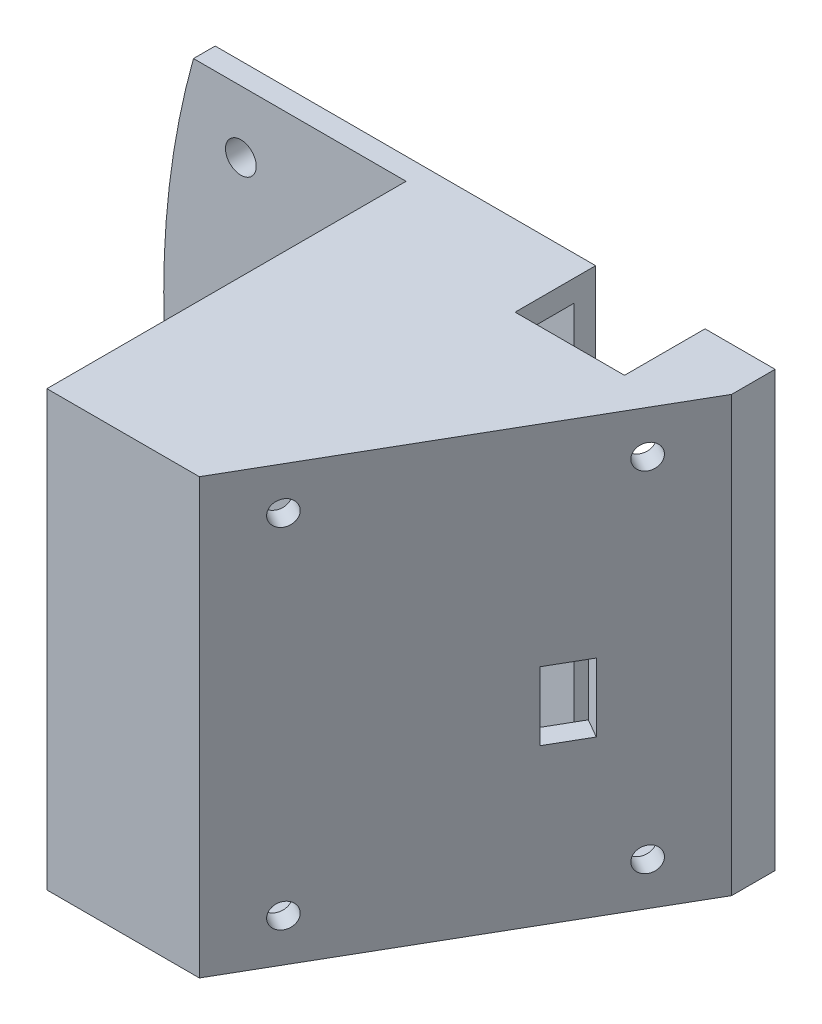
ISO-10303-21;
HEADER;
FILE_DESCRIPTION(('STEP AP214'),'2;1');
FILE_NAME('part.step','',(''),(''),'','','');
FILE_SCHEMA(('AUTOMOTIVE_DESIGN { 1 0 10303 214 1 1 1 1 }'));
ENDSEC;
DATA;
#1=APPLICATION_CONTEXT('core data for automotive mechanical design processes');
#2=APPLICATION_PROTOCOL_DEFINITION('international standard','automotive_design',2000,#1);
#3=PRODUCT_CONTEXT('',#1,'mechanical');
#4=PRODUCT('Part','Part','',(#3));
#5=PRODUCT_RELATED_PRODUCT_CATEGORY('part','',(#4));
#6=PRODUCT_DEFINITION_FORMATION('','',#4);
#7=PRODUCT_DEFINITION_CONTEXT('part definition',#1,'design');
#8=PRODUCT_DEFINITION('design','',#6,#7);
#9=PRODUCT_DEFINITION_SHAPE('','',#8);
#10=(LENGTH_UNIT() NAMED_UNIT(*) SI_UNIT(.MILLI.,.METRE.));
#11=(NAMED_UNIT(*) PLANE_ANGLE_UNIT() SI_UNIT($,.RADIAN.));
#12=(NAMED_UNIT(*) SI_UNIT($,.STERADIAN.) SOLID_ANGLE_UNIT());
#13=UNCERTAINTY_MEASURE_WITH_UNIT(LENGTH_MEASURE(1.E-05),#10,'distance_accuracy_value','');
#14=(GEOMETRIC_REPRESENTATION_CONTEXT(3) GLOBAL_UNCERTAINTY_ASSIGNED_CONTEXT((#13)) GLOBAL_UNIT_ASSIGNED_CONTEXT((#10,
#11,#12)) REPRESENTATION_CONTEXT('',''));
#15=CARTESIAN_POINT('',(0.,0.,0.));
#16=DIRECTION('',(0.,0.,1.));
#17=DIRECTION('',(1.,0.,0.));
#18=AXIS2_PLACEMENT_3D('',#15,#16,#17);
#19=CARTESIAN_POINT('',(-31.75,31.75,6.35));
#20=DIRECTION('',(-0.86602540378444,0.,-0.499999999999998));
#21=DIRECTION('',(-0.499999999999998,0.,0.86602540378444));
#22=AXIS2_PLACEMENT_3D('',#19,#20,#21);
#23=PLANE('',#22);
#24=CARTESIAN_POINT('',(-55.7499999999999,-25.5,47.9192193816531));
#25=DIRECTION('',(0.86602540378444,0.,0.499999999999998));
#26=DIRECTION('',(0.499999999999998,0.,-0.86602540378444));
#27=AXIS2_PLACEMENT_3D('',#24,#25,#26);
#28=CIRCLE('',#27,1.8);
#29=CARTESIAN_POINT('',(-54.8499999999999,-25.5,46.3603736548411));
#30=VERTEX_POINT('',#29);
#31=EDGE_CURVE('E266',#30,#30,#28,.T.);
#32=ORIENTED_EDGE('',*,*,#31,.F.);
#33=EDGE_LOOP('',(#32));
#34=FACE_BOUND('',#33,.T.);
#35=CARTESIAN_POINT('',(-36.25,-25.5,14.14422863406));
#36=DIRECTION('',(0.86602540378444,0.,0.499999999999998));
#37=DIRECTION('',(0.499999999999998,0.,-0.86602540378444));
#38=AXIS2_PLACEMENT_3D('',#35,#36,#37);
#39=CIRCLE('',#38,1.8);
#40=CARTESIAN_POINT('',(-35.35,-25.5,12.585382907248));
#41=VERTEX_POINT('',#40);
#42=EDGE_CURVE('E284',#41,#41,#39,.T.);
#43=ORIENTED_EDGE('',*,*,#42,.F.);
#44=EDGE_LOOP('',(#43));
#45=FACE_BOUND('',#44,.T.);
#46=DIRECTION('',(0.,-1.,0.));
#47=VECTOR('',#46,1.);
#48=CARTESIAN_POINT('',(-60.2499999999999,31.75,55.7134480157131));
#49=LINE('',#48,#47);
#50=CARTESIAN_POINT('',(-60.2499999999999,31.75,55.7134480157131));
#51=VERTEX_POINT('',#50);
#52=CARTESIAN_POINT('',(-60.2499999999999,-31.75,55.7134480157131));
#53=VERTEX_POINT('',#52);
#54=EDGE_CURVE('E398',#51,#53,#49,.T.);
#55=ORIENTED_EDGE('',*,*,#54,.T.);
#56=DIRECTION('',(0.499999999999998,0.,-0.86602540378444));
#57=VECTOR('',#56,1.);
#58=CARTESIAN_POINT('',(-31.75,-31.75,6.35));
#59=LINE('',#58,#57);
#60=CARTESIAN_POINT('',(-31.75,-31.75,6.35));
#61=VERTEX_POINT('',#60);
#62=EDGE_CURVE('E376',#53,#61,#59,.T.);
#63=ORIENTED_EDGE('',*,*,#62,.T.);
#64=DIRECTION('',(0.,-1.,0.));
#65=VECTOR('',#64,1.);
#66=CARTESIAN_POINT('',(-31.75,31.75,6.35));
#67=LINE('',#66,#65);
#68=CARTESIAN_POINT('',(-31.75,31.75,6.35));
#69=VERTEX_POINT('',#68);
#70=EDGE_CURVE('E396',#69,#61,#67,.T.);
#71=ORIENTED_EDGE('',*,*,#70,.F.);
#72=DIRECTION('',(0.499999999999998,0.,-0.86602540378444));
#73=VECTOR('',#72,1.);
#74=CARTESIAN_POINT('',(-31.75,31.75,6.35));
#75=LINE('',#74,#73);
#76=EDGE_CURVE('E389',#51,#69,#75,.T.);
#77=ORIENTED_EDGE('',*,*,#76,.F.);
#78=EDGE_LOOP('',(#55,#63,#71,#77));
#79=FACE_BOUND('',#78,.T.);
#80=CARTESIAN_POINT('',(-36.25,25.5,14.14422863406));
#81=DIRECTION('',(0.86602540378444,0.,0.499999999999998));
#82=DIRECTION('',(0.499999999999998,0.,-0.86602540378444));
#83=AXIS2_PLACEMENT_3D('',#80,#81,#82);
#84=CIRCLE('',#83,1.8);
#85=CARTESIAN_POINT('',(-35.35,25.5,12.585382907248));
#86=VERTEX_POINT('',#85);
#87=EDGE_CURVE('E278',#86,#86,#84,.T.);
#88=ORIENTED_EDGE('',*,*,#87,.F.);
#89=EDGE_LOOP('',(#88));
#90=FACE_BOUND('',#89,.T.);
#91=CARTESIAN_POINT('',(-55.7499999999999,25.5,47.9192193816531));
#92=DIRECTION('',(0.86602540378444,0.,0.499999999999998));
#93=DIRECTION('',(0.499999999999998,0.,-0.86602540378444));
#94=AXIS2_PLACEMENT_3D('',#91,#92,#93);
#95=CIRCLE('',#94,1.8);
#96=CARTESIAN_POINT('',(-54.8499999999999,25.5,46.3603736548411));
#97=VERTEX_POINT('',#96);
#98=EDGE_CURVE('E272',#97,#97,#95,.T.);
#99=ORIENTED_EDGE('',*,*,#98,.F.);
#100=EDGE_LOOP('',(#99));
#101=FACE_BOUND('',#100,.T.);
#102=DIRECTION('',(0.,1.,0.));
#103=VECTOR('',#102,1.);
#104=CARTESIAN_POINT('',(-42.,1.00000000000002,24.103520777581));
#105=LINE('',#104,#103);
#106=CARTESIAN_POINT('',(-42.,-8.99999999999998,24.103520777581));
#107=VERTEX_POINT('',#106);
#108=CARTESIAN_POINT('',(-42.,1.00000000000002,24.103520777581));
#109=VERTEX_POINT('',#108);
#110=EDGE_CURVE('E50',#107,#109,#105,.T.);
#111=ORIENTED_EDGE('',*,*,#110,.T.);
#112=DIRECTION('',(0.499999999999998,0.,-0.86602540378444));
#113=VECTOR('',#112,1.);
#114=CARTESIAN_POINT('',(-39.,1.00000000000002,18.9073683548744));
#115=LINE('',#114,#113);
#116=CARTESIAN_POINT('',(-39.,1.00000000000002,18.9073683548744));
#117=VERTEX_POINT('',#116);
#118=EDGE_CURVE('E201',#109,#117,#115,.T.);
#119=ORIENTED_EDGE('',*,*,#118,.T.);
#120=DIRECTION('',(0.,-1.,0.));
#121=VECTOR('',#120,1.);
#122=CARTESIAN_POINT('',(-39.,1.00000000000002,18.9073683548744));
#123=LINE('',#122,#121);
#124=CARTESIAN_POINT('',(-39.,-8.99999999999998,18.9073683548744));
#125=VERTEX_POINT('',#124);
#126=EDGE_CURVE('E222',#117,#125,#123,.T.);
#127=ORIENTED_EDGE('',*,*,#126,.T.);
#128=DIRECTION('',(-0.499999999999998,0.,0.86602540378444));
#129=VECTOR('',#128,1.);
#130=CARTESIAN_POINT('',(-39.,-8.99999999999998,18.9073683548744));
#131=LINE('',#130,#129);
#132=EDGE_CURVE('E218',#125,#107,#131,.T.);
#133=ORIENTED_EDGE('',*,*,#132,.T.);
#134=EDGE_LOOP('',(#111,#119,#127,#133));
#135=FACE_BOUND('',#134,.T.);
#136=ADVANCED_FACE('F35',(#34,#45,#79,#90,#101,#135),#23,.F.);
#137=CARTESIAN_POINT('',(-34.4996306570156,31.75,4.76250000000001));
#138=DIRECTION('',(-0.86602540378444,0.,-0.499999999999998));
#139=DIRECTION('',(-0.499999999999998,0.,0.86602540378444));
#140=AXIS2_PLACEMENT_3D('',#137,#138,#139);
#141=PLANE('',#140);
#142=CARTESIAN_POINT('',(-38.9996306570156,25.5,12.55672863406));
#143=DIRECTION('',(-0.86602540378444,0.,-0.499999999999998));
#144=DIRECTION('',(-0.499999999999998,0.,0.86602540378444));
#145=AXIS2_PLACEMENT_3D('',#142,#143,#144);
#146=CIRCLE('',#145,1.8);
#147=CARTESIAN_POINT('',(-39.8996306570156,25.5,14.115574360872));
#148=VERTEX_POINT('',#147);
#149=EDGE_CURVE('E281',#148,#148,#146,.F.);
#150=ORIENTED_EDGE('',*,*,#149,.T.);
#151=EDGE_LOOP('',(#150));
#152=FACE_BOUND('',#151,.T.);
#153=DIRECTION('',(0.,-1.,0.));
#154=VECTOR('',#153,1.);
#155=CARTESIAN_POINT('',(-62.0830871046769,31.75,52.5384480157131));
#156=LINE('',#155,#154);
#157=CARTESIAN_POINT('',(-62.0830871046769,28.575,52.5384480157131));
#158=VERTEX_POINT('',#157);
#159=CARTESIAN_POINT('',(-62.0830871046769,-28.575,52.5384480157131));
#160=VERTEX_POINT('',#159);
#161=EDGE_CURVE('E312',#158,#160,#156,.T.);
#162=ORIENTED_EDGE('',*,*,#161,.F.);
#163=DIRECTION('',(0.499999999999998,0.,-0.86602540378444));
#164=VECTOR('',#163,1.);
#165=CARTESIAN_POINT('',(-23.8125000000001,28.575,-13.7481532850779));
#166=LINE('',#165,#164);
#167=CARTESIAN_POINT('',(-34.925,28.575,5.49926131403118));
#168=VERTEX_POINT('',#167);
#169=EDGE_CURVE('E310',#158,#168,#166,.T.);
#170=ORIENTED_EDGE('',*,*,#169,.T.);
#171=DIRECTION('',(0.,-1.,0.));
#172=VECTOR('',#171,1.);
#173=CARTESIAN_POINT('',(-34.925,31.75,5.49926131403118));
#174=LINE('',#173,#172);
#175=CARTESIAN_POINT('',(-34.925,-28.575,5.49926131403118));
#176=VERTEX_POINT('',#175);
#177=EDGE_CURVE('E294',#168,#176,#174,.T.);
#178=ORIENTED_EDGE('',*,*,#177,.T.);
#179=DIRECTION('',(0.499999999999998,0.,-0.86602540378444));
#180=VECTOR('',#179,1.);
#181=CARTESIAN_POINT('',(-23.8125000000001,-28.575,-13.7481532850779));
#182=LINE('',#181,#180);
#183=EDGE_CURVE('E308',#160,#176,#182,.T.);
#184=ORIENTED_EDGE('',*,*,#183,.F.);
#185=EDGE_LOOP('',(#162,#170,#178,#184));
#186=FACE_BOUND('',#185,.T.);
#187=CARTESIAN_POINT('',(-38.9996306570156,-25.5,12.55672863406));
#188=DIRECTION('',(-0.86602540378444,0.,-0.499999999999998));
#189=DIRECTION('',(-0.499999999999998,0.,0.86602540378444));
#190=AXIS2_PLACEMENT_3D('',#187,#188,#189);
#191=CIRCLE('',#190,1.8);
#192=CARTESIAN_POINT('',(-39.8996306570156,-25.5,14.115574360872));
#193=VERTEX_POINT('',#192);
#194=EDGE_CURVE('E287',#193,#193,#191,.F.);
#195=ORIENTED_EDGE('',*,*,#194,.T.);
#196=EDGE_LOOP('',(#195));
#197=FACE_BOUND('',#196,.T.);
#198=CARTESIAN_POINT('',(-58.4996306570155,25.5,46.3317193816531));
#199=DIRECTION('',(-0.86602540378444,0.,-0.499999999999998));
#200=DIRECTION('',(-0.499999999999998,0.,0.86602540378444));
#201=AXIS2_PLACEMENT_3D('',#198,#199,#200);
#202=CIRCLE('',#201,1.8);
#203=CARTESIAN_POINT('',(-59.3996306570155,25.5,47.8905651084651));
#204=VERTEX_POINT('',#203);
#205=EDGE_CURVE('E275',#204,#204,#202,.F.);
#206=ORIENTED_EDGE('',*,*,#205,.T.);
#207=EDGE_LOOP('',(#206));
#208=FACE_BOUND('',#207,.T.);
#209=CARTESIAN_POINT('',(-58.4996306570155,-25.5,46.3317193816531));
#210=DIRECTION('',(-0.86602540378444,0.,-0.499999999999998));
#211=DIRECTION('',(-0.499999999999998,0.,0.86602540378444));
#212=AXIS2_PLACEMENT_3D('',#209,#210,#211);
#213=CIRCLE('',#212,1.8);
#214=CARTESIAN_POINT('',(-59.3996306570155,-25.5,47.8905651084651));
#215=VERTEX_POINT('',#214);
#216=EDGE_CURVE('E269',#215,#215,#213,.F.);
#217=ORIENTED_EDGE('',*,*,#216,.T.);
#218=EDGE_LOOP('',(#217));
#219=FACE_BOUND('',#218,.T.);
#220=DIRECTION('',(0.499999999999998,0.,-0.86602540378444));
#221=VECTOR('',#220,1.);
#222=CARTESIAN_POINT('',(-41.7496306570156,1.00000000000002,17.3198683548744));
#223=LINE('',#222,#221);
#224=CARTESIAN_POINT('',(-44.7496306570156,1.00000000000002,22.516020777581));
#225=VERTEX_POINT('',#224);
#226=CARTESIAN_POINT('',(-41.7496306570156,1.00000000000002,17.3198683548744));
#227=VERTEX_POINT('',#226);
#228=EDGE_CURVE('E199',#225,#227,#223,.T.);
#229=ORIENTED_EDGE('',*,*,#228,.F.);
#230=DIRECTION('',(0.,1.,0.));
#231=VECTOR('',#230,1.);
#232=CARTESIAN_POINT('',(-44.7496306570156,1.00000000000002,22.516020777581));
#233=LINE('',#232,#231);
#234=CARTESIAN_POINT('',(-44.7496306570155,-8.99999999999998,22.516020777581));
#235=VERTEX_POINT('',#234);
#236=EDGE_CURVE('E204',#235,#225,#233,.T.);
#237=ORIENTED_EDGE('',*,*,#236,.F.);
#238=DIRECTION('',(-0.499999999999998,0.,0.86602540378444));
#239=VECTOR('',#238,1.);
#240=CARTESIAN_POINT('',(-41.7496306570156,-8.99999999999998,17.3198683548744));
#241=LINE('',#240,#239);
#242=CARTESIAN_POINT('',(-41.7496306570156,-8.99999999999998,17.3198683548744));
#243=VERTEX_POINT('',#242);
#244=EDGE_CURVE('E210',#243,#235,#241,.T.);
#245=ORIENTED_EDGE('',*,*,#244,.F.);
#246=DIRECTION('',(0.,-1.,0.));
#247=VECTOR('',#246,1.);
#248=CARTESIAN_POINT('',(-41.7496306570156,1.00000000000002,17.3198683548744));
#249=LINE('',#248,#247);
#250=EDGE_CURVE('E58',#227,#243,#249,.T.);
#251=ORIENTED_EDGE('',*,*,#250,.F.);
#252=EDGE_LOOP('',(#229,#237,#245,#251));
#253=FACE_BOUND('',#252,.T.);
#254=ADVANCED_FACE('F212',(#152,#186,#197,#208,#219,#253),#141,.T.);
#255=CARTESIAN_POINT('',(-31.75,31.75,0.));
#256=DIRECTION('',(0.,0.,1.));
#257=DIRECTION('',(1.,0.,0.));
#258=AXIS2_PLACEMENT_3D('',#255,#256,#257);
#259=PLANE('',#258);
#260=DIRECTION('',(0.,-1.,0.));
#261=VECTOR('',#260,1.);
#262=CARTESIAN_POINT('',(-42.,31.75,0.));
#263=LINE('',#262,#261);
#264=CARTESIAN_POINT('',(-42.,31.75,0.));
#265=VERTEX_POINT('',#264);
#266=CARTESIAN_POINT('',(-42.,-31.75,0.));
#267=VERTEX_POINT('',#266);
#268=EDGE_CURVE('E241',#265,#267,#263,.T.);
#269=ORIENTED_EDGE('',*,*,#268,.F.);
#270=DIRECTION('',(-1.,0.,0.));
#271=VECTOR('',#270,1.);
#272=CARTESIAN_POINT('',(-31.75,31.75,0.));
#273=LINE('',#272,#271);
#274=CARTESIAN_POINT('',(-31.75,31.75,0.));
#275=VERTEX_POINT('',#274);
#276=EDGE_CURVE('E382',#275,#265,#273,.T.);
#277=ORIENTED_EDGE('',*,*,#276,.F.);
#278=DIRECTION('',(0.,-1.,0.));
#279=VECTOR('',#278,1.);
#280=CARTESIAN_POINT('',(-31.75,31.75,0.));
#281=LINE('',#280,#279);
#282=CARTESIAN_POINT('',(-31.75,-31.75,0.));
#283=VERTEX_POINT('',#282);
#284=EDGE_CURVE('E393',#275,#283,#281,.T.);
#285=ORIENTED_EDGE('',*,*,#284,.T.);
#286=DIRECTION('',(-1.,0.,0.));
#287=VECTOR('',#286,1.);
#288=CARTESIAN_POINT('',(-31.75,-31.75,0.));
#289=LINE('',#288,#287);
#290=EDGE_CURVE('E368',#283,#267,#289,.T.);
#291=ORIENTED_EDGE('',*,*,#290,.T.);
#292=EDGE_LOOP('',(#269,#277,#285,#291));
#293=FACE_BOUND('',#292,.T.);
#294=ADVANCED_FACE('F487',(#293),#259,.F.);
#295=CARTESIAN_POINT('',(0.,31.75,0.));
#296=DIRECTION('',(0.,-1.,0.));
#297=DIRECTION('',(0.,0.,-1.));
#298=AXIS2_PLACEMENT_3D('',#295,#296,#297);
#299=PLANE('',#298);
#300=DIRECTION('',(0.,0.,-1.));
#301=VECTOR('',#300,1.);
#302=CARTESIAN_POINT('',(-42.,31.75,0.));
#303=LINE('',#302,#301);
#304=CARTESIAN_POINT('',(-42.,31.75,11.7784789100374));
#305=VERTEX_POINT('',#304);
#306=EDGE_CURVE('E226',#305,#265,#303,.T.);
#307=ORIENTED_EDGE('',*,*,#306,.F.);
#308=DIRECTION('',(1.,0.,0.));
#309=VECTOR('',#308,1.);
#310=CARTESIAN_POINT('',(0.,31.75,11.7784789100374));
#311=LINE('',#310,#309);
#312=CARTESIAN_POINT('',(-58.,31.75,11.7784789100374));
#313=VERTEX_POINT('',#312);
#314=EDGE_CURVE('E228',#313,#305,#311,.T.);
#315=ORIENTED_EDGE('',*,*,#314,.F.);
#316=DIRECTION('',(0.,0.,-1.));
#317=VECTOR('',#316,1.);
#318=CARTESIAN_POINT('',(-58.,31.75,0.));
#319=LINE('',#318,#317);
#320=CARTESIAN_POINT('',(-58.,31.75,0.));
#321=VERTEX_POINT('',#320);
#322=EDGE_CURVE('E231',#313,#321,#319,.T.);
#323=ORIENTED_EDGE('',*,*,#322,.T.);
#324=CARTESIAN_POINT('',(-113.647797428019,31.75,0.));
#325=VERTEX_POINT('',#324);
#326=EDGE_CURVE('E381',#321,#325,#273,.T.);
#327=ORIENTED_EDGE('',*,*,#326,.T.);
#328=DIRECTION('',(0.,0.,-1.));
#329=VECTOR('',#328,1.);
#330=CARTESIAN_POINT('',(-113.647797428019,31.75,3.175));
#331=LINE('',#330,#329);
#332=CARTESIAN_POINT('',(-113.647797428019,31.75,3.175));
#333=VERTEX_POINT('',#332);
#334=EDGE_CURVE('E360',#333,#325,#331,.T.);
#335=ORIENTED_EDGE('',*,*,#334,.F.);
#336=DIRECTION('',(1.,0.,0.));
#337=VECTOR('',#336,1.);
#338=CARTESIAN_POINT('',(0.,31.75,3.175));
#339=LINE('',#338,#337);
#340=CARTESIAN_POINT('',(-82.55,31.75,3.17500000000001));
#341=VERTEX_POINT('',#340);
#342=EDGE_CURVE('E339',#333,#341,#339,.T.);
#343=ORIENTED_EDGE('',*,*,#342,.T.);
#344=DIRECTION('',(0.,0.,1.));
#345=VECTOR('',#344,1.);
#346=CARTESIAN_POINT('',(-82.55,31.75,55.7134480157131));
#347=LINE('',#346,#345);
#348=CARTESIAN_POINT('',(-82.55,31.75,55.7134480157131));
#349=VERTEX_POINT('',#348);
#350=EDGE_CURVE('E385',#341,#349,#347,.T.);
#351=ORIENTED_EDGE('',*,*,#350,.T.);
#352=DIRECTION('',(1.,0.,0.));
#353=VECTOR('',#352,1.);
#354=CARTESIAN_POINT('',(-60.2499999999999,31.75,55.7134480157131));
#355=LINE('',#354,#353);
#356=EDGE_CURVE('E387',#349,#51,#355,.T.);
#357=ORIENTED_EDGE('',*,*,#356,.T.);
#358=ORIENTED_EDGE('',*,*,#76,.T.);
#359=DIRECTION('',(0.,0.,-1.));
#360=VECTOR('',#359,1.);
#361=CARTESIAN_POINT('',(-31.75,31.75,0.));
#362=LINE('',#361,#360);
#363=EDGE_CURVE('E391',#69,#275,#362,.T.);
#364=ORIENTED_EDGE('',*,*,#363,.T.);
#365=ORIENTED_EDGE('',*,*,#276,.T.);
#366=EDGE_LOOP('',(#307,#315,#323,#327,#335,#343,#351,#357,#358,#364,#365));
#367=FACE_BOUND('',#366,.T.);
#368=ADVANCED_FACE('F439',(#367),#299,.F.);
#369=CARTESIAN_POINT('',(0.,-31.75,0.));
#370=DIRECTION('',(0.,-1.,0.));
#371=DIRECTION('',(0.,0.,-1.));
#372=AXIS2_PLACEMENT_3D('',#369,#370,#371);
#373=PLANE('',#372);
#374=DIRECTION('',(1.,0.,0.));
#375=VECTOR('',#374,1.);
#376=CARTESIAN_POINT('',(0.,-31.75,11.7784789100374));
#377=LINE('',#376,#375);
#378=CARTESIAN_POINT('',(-58.,-31.75,11.7784789100374));
#379=VERTEX_POINT('',#378);
#380=CARTESIAN_POINT('',(-42.,-31.75,11.7784789100374));
#381=VERTEX_POINT('',#380);
#382=EDGE_CURVE('E237',#379,#381,#377,.T.);
#383=ORIENTED_EDGE('',*,*,#382,.T.);
#384=DIRECTION('',(0.,0.,-1.));
#385=VECTOR('',#384,1.);
#386=CARTESIAN_POINT('',(-42.,-31.75,0.));
#387=LINE('',#386,#385);
#388=EDGE_CURVE('E214',#381,#267,#387,.T.);
#389=ORIENTED_EDGE('',*,*,#388,.T.);
#390=ORIENTED_EDGE('',*,*,#290,.F.);
#391=DIRECTION('',(0.,0.,-1.));
#392=VECTOR('',#391,1.);
#393=CARTESIAN_POINT('',(-31.75,-31.75,0.));
#394=LINE('',#393,#392);
#395=EDGE_CURVE('E379',#61,#283,#394,.T.);
#396=ORIENTED_EDGE('',*,*,#395,.F.);
#397=ORIENTED_EDGE('',*,*,#62,.F.);
#398=DIRECTION('',(1.,0.,0.));
#399=VECTOR('',#398,1.);
#400=CARTESIAN_POINT('',(-60.2499999999999,-31.75,55.7134480157131));
#401=LINE('',#400,#399);
#402=CARTESIAN_POINT('',(-82.55,-31.75,55.7134480157131));
#403=VERTEX_POINT('',#402);
#404=EDGE_CURVE('E373',#403,#53,#401,.T.);
#405=ORIENTED_EDGE('',*,*,#404,.F.);
#406=DIRECTION('',(0.,0.,1.));
#407=VECTOR('',#406,1.);
#408=CARTESIAN_POINT('',(-82.55,-31.75,55.7134480157131));
#409=LINE('',#408,#407);
#410=CARTESIAN_POINT('',(-82.55,-31.75,3.17500000000001));
#411=VERTEX_POINT('',#410);
#412=EDGE_CURVE('E371',#411,#403,#409,.T.);
#413=ORIENTED_EDGE('',*,*,#412,.F.);
#414=DIRECTION('',(-1.,0.,0.));
#415=VECTOR('',#414,1.);
#416=CARTESIAN_POINT('',(0.,-31.75,3.175));
#417=LINE('',#416,#415);
#418=CARTESIAN_POINT('',(-113.647797428019,-31.75,3.175));
#419=VERTEX_POINT('',#418);
#420=EDGE_CURVE('E345',#411,#419,#417,.T.);
#421=ORIENTED_EDGE('',*,*,#420,.T.);
#422=DIRECTION('',(0.,0.,-1.));
#423=VECTOR('',#422,1.);
#424=CARTESIAN_POINT('',(-113.647797428019,-31.75,3.175));
#425=LINE('',#424,#423);
#426=CARTESIAN_POINT('',(-113.647797428019,-31.75,0.));
#427=VERTEX_POINT('',#426);
#428=EDGE_CURVE('E347',#419,#427,#425,.T.);
#429=ORIENTED_EDGE('',*,*,#428,.T.);
#430=CARTESIAN_POINT('',(-58.,-31.75,0.));
#431=VERTEX_POINT('',#430);
#432=EDGE_CURVE('E367',#431,#427,#289,.T.);
#433=ORIENTED_EDGE('',*,*,#432,.F.);
#434=DIRECTION('',(0.,0.,-1.));
#435=VECTOR('',#434,1.);
#436=CARTESIAN_POINT('',(-58.,-31.75,0.));
#437=LINE('',#436,#435);
#438=EDGE_CURVE('E229',#379,#431,#437,.T.);
#439=ORIENTED_EDGE('',*,*,#438,.F.);
#440=EDGE_LOOP('',(#383,#389,#390,#396,#397,#405,#413,#421,#429,#433,#439));
#441=FACE_BOUND('',#440,.T.);
#442=ADVANCED_FACE('F426',(#441),#373,.T.);
#443=CARTESIAN_POINT('',(0.,0.,3.175));
#444=DIRECTION('',(0.,0.,1.));
#445=DIRECTION('',(1.,0.,0.));
#446=AXIS2_PLACEMENT_3D('',#443,#444,#445);
#447=PLANE('',#446);
#448=DIRECTION('',(-1.,0.,0.));
#449=VECTOR('',#448,1.);
#450=CARTESIAN_POINT('',(0.,28.575,3.175));
#451=LINE('',#450,#449);
#452=CARTESIAN_POINT('',(-34.925,28.575,3.175));
#453=VERTEX_POINT('',#452);
#454=CARTESIAN_POINT('',(-42.,28.575,3.175));
#455=VERTEX_POINT('',#454);
#456=EDGE_CURVE('E300',#453,#455,#451,.T.);
#457=ORIENTED_EDGE('',*,*,#456,.T.);
#458=DIRECTION('',(0.,-1.,0.));
#459=VECTOR('',#458,1.);
#460=CARTESIAN_POINT('',(-42.,0.,3.175));
#461=LINE('',#460,#459);
#462=CARTESIAN_POINT('',(-42.,-28.575,3.175));
#463=VERTEX_POINT('',#462);
#464=EDGE_CURVE('E260',#455,#463,#461,.T.);
#465=ORIENTED_EDGE('',*,*,#464,.T.);
#466=DIRECTION('',(-1.,0.,0.));
#467=VECTOR('',#466,1.);
#468=CARTESIAN_POINT('',(0.,-28.575,3.175));
#469=LINE('',#468,#467);
#470=CARTESIAN_POINT('',(-34.925,-28.575,3.175));
#471=VERTEX_POINT('',#470);
#472=EDGE_CURVE('E296',#471,#463,#469,.T.);
#473=ORIENTED_EDGE('',*,*,#472,.F.);
#474=DIRECTION('',(0.,-1.,0.));
#475=VECTOR('',#474,1.);
#476=CARTESIAN_POINT('',(-34.925,31.75,3.175));
#477=LINE('',#476,#475);
#478=EDGE_CURVE('E291',#453,#471,#477,.T.);
#479=ORIENTED_EDGE('',*,*,#478,.F.);
#480=EDGE_LOOP('',(#457,#465,#473,#479));
#481=FACE_BOUND('',#480,.T.);
#482=ADVANCED_FACE('F466',(#481),#447,.T.);
#483=CARTESIAN_POINT('',(0.,28.575,0.));
#484=DIRECTION('',(0.,-1.,0.));
#485=DIRECTION('',(0.,0.,-1.));
#486=AXIS2_PLACEMENT_3D('',#483,#484,#485);
#487=PLANE('',#486);
#488=DIRECTION('',(1.,0.,0.));
#489=VECTOR('',#488,1.);
#490=CARTESIAN_POINT('',(0.,28.575,11.7784789100374));
#491=LINE('',#490,#489);
#492=CARTESIAN_POINT('',(-58.,28.575,11.7784789100374));
#493=VERTEX_POINT('',#492);
#494=CARTESIAN_POINT('',(-42.,28.575,11.7784789100374));
#495=VERTEX_POINT('',#494);
#496=EDGE_CURVE('E243',#493,#495,#491,.T.);
#497=ORIENTED_EDGE('',*,*,#496,.T.);
#498=DIRECTION('',(0.,0.,-1.));
#499=VECTOR('',#498,1.);
#500=CARTESIAN_POINT('',(-42.,28.575,0.));
#501=LINE('',#500,#499);
#502=EDGE_CURVE('E263',#495,#455,#501,.T.);
#503=ORIENTED_EDGE('',*,*,#502,.T.);
#504=ORIENTED_EDGE('',*,*,#456,.F.);
#505=DIRECTION('',(0.,0.,-1.));
#506=VECTOR('',#505,1.);
#507=CARTESIAN_POINT('',(-34.925,28.575,0.));
#508=LINE('',#507,#506);
#509=EDGE_CURVE('E295',#168,#453,#508,.T.);
#510=ORIENTED_EDGE('',*,*,#509,.F.);
#511=ORIENTED_EDGE('',*,*,#169,.F.);
#512=DIRECTION('',(1.,0.,0.));
#513=VECTOR('',#512,1.);
#514=CARTESIAN_POINT('',(0.,28.575,52.5384480157131));
#515=LINE('',#514,#513);
#516=CARTESIAN_POINT('',(-82.55,28.575,52.5384480157131));
#517=VERTEX_POINT('',#516);
#518=EDGE_CURVE('E319',#517,#158,#515,.T.);
#519=ORIENTED_EDGE('',*,*,#518,.F.);
#520=DIRECTION('',(0.,0.,1.));
#521=VECTOR('',#520,1.);
#522=CARTESIAN_POINT('',(-82.55,28.575,0.));
#523=LINE('',#522,#521);
#524=CARTESIAN_POINT('',(-82.55,28.575,3.175));
#525=VERTEX_POINT('',#524);
#526=EDGE_CURVE('E303',#525,#517,#523,.T.);
#527=ORIENTED_EDGE('',*,*,#526,.F.);
#528=CARTESIAN_POINT('',(-58.,28.575,3.175));
#529=VERTEX_POINT('',#528);
#530=EDGE_CURVE('E304',#529,#525,#451,.T.);
#531=ORIENTED_EDGE('',*,*,#530,.F.);
#532=DIRECTION('',(0.,0.,-1.));
#533=VECTOR('',#532,1.);
#534=CARTESIAN_POINT('',(-58.,28.575,0.));
#535=LINE('',#534,#533);
#536=EDGE_CURVE('E258',#493,#529,#535,.T.);
#537=ORIENTED_EDGE('',*,*,#536,.F.);
#538=EDGE_LOOP('',(#497,#503,#504,#510,#511,#519,#527,#531,#537));
#539=FACE_BOUND('',#538,.T.);
#540=ADVANCED_FACE('F461',(#539),#487,.T.);
#541=CARTESIAN_POINT('',(0.,-28.575,0.));
#542=DIRECTION('',(0.,-1.,0.));
#543=DIRECTION('',(0.,0.,-1.));
#544=AXIS2_PLACEMENT_3D('',#541,#542,#543);
#545=PLANE('',#544);
#546=DIRECTION('',(0.,0.,-1.));
#547=VECTOR('',#546,1.);
#548=CARTESIAN_POINT('',(-42.,-28.575,0.));
#549=LINE('',#548,#547);
#550=CARTESIAN_POINT('',(-42.,-28.575,11.7784789100374));
#551=VERTEX_POINT('',#550);
#552=EDGE_CURVE('E11',#551,#463,#549,.T.);
#553=ORIENTED_EDGE('',*,*,#552,.F.);
#554=DIRECTION('',(1.,0.,0.));
#555=VECTOR('',#554,1.);
#556=CARTESIAN_POINT('',(0.,-28.575,11.7784789100374));
#557=LINE('',#556,#555);
#558=CARTESIAN_POINT('',(-58.,-28.575,11.7784789100374));
#559=VERTEX_POINT('',#558);
#560=EDGE_CURVE('E403',#559,#551,#557,.T.);
#561=ORIENTED_EDGE('',*,*,#560,.F.);
#562=DIRECTION('',(0.,0.,-1.));
#563=VECTOR('',#562,1.);
#564=CARTESIAN_POINT('',(-58.,-28.575,0.));
#565=LINE('',#564,#563);
#566=CARTESIAN_POINT('',(-58.,-28.575,3.175));
#567=VERTEX_POINT('',#566);
#568=EDGE_CURVE('E43',#559,#567,#565,.T.);
#569=ORIENTED_EDGE('',*,*,#568,.T.);
#570=CARTESIAN_POINT('',(-82.55,-28.575,3.175));
#571=VERTEX_POINT('',#570);
#572=EDGE_CURVE('E290',#567,#571,#469,.T.);
#573=ORIENTED_EDGE('',*,*,#572,.T.);
#574=DIRECTION('',(0.,0.,1.));
#575=VECTOR('',#574,1.);
#576=CARTESIAN_POINT('',(-82.55,-28.575,0.));
#577=LINE('',#576,#575);
#578=CARTESIAN_POINT('',(-82.55,-28.575,52.5384480157131));
#579=VERTEX_POINT('',#578);
#580=EDGE_CURVE('E299',#571,#579,#577,.T.);
#581=ORIENTED_EDGE('',*,*,#580,.T.);
#582=DIRECTION('',(1.,0.,0.));
#583=VECTOR('',#582,1.);
#584=CARTESIAN_POINT('',(0.,-28.575,52.5384480157131));
#585=LINE('',#584,#583);
#586=EDGE_CURVE('E317',#579,#160,#585,.T.);
#587=ORIENTED_EDGE('',*,*,#586,.T.);
#588=ORIENTED_EDGE('',*,*,#183,.T.);
#589=DIRECTION('',(0.,0.,-1.));
#590=VECTOR('',#589,1.);
#591=CARTESIAN_POINT('',(-34.925,-28.575,0.));
#592=LINE('',#591,#590);
#593=EDGE_CURVE('E305',#176,#471,#592,.T.);
#594=ORIENTED_EDGE('',*,*,#593,.T.);
#595=ORIENTED_EDGE('',*,*,#472,.T.);
#596=EDGE_LOOP('',(#553,#561,#569,#573,#581,#587,#588,#594,#595));
#597=FACE_BOUND('',#596,.T.);
#598=ADVANCED_FACE('F410',(#597),#545,.F.);
#599=CARTESIAN_POINT('',(-82.55,31.75,55.7134480157131));
#600=DIRECTION('',(1.,0.,0.));
#601=DIRECTION('',(0.,0.,-1.));
#602=AXIS2_PLACEMENT_3D('',#599,#600,#601);
#603=PLANE('',#602);
#604=ORIENTED_EDGE('',*,*,#580,.F.);
#605=DIRECTION('',(0.,-1.,0.));
#606=VECTOR('',#605,1.);
#607=CARTESIAN_POINT('',(-82.55,31.75,3.175));
#608=LINE('',#607,#606);
#609=EDGE_CURVE('E363',#571,#411,#608,.T.);
#610=ORIENTED_EDGE('',*,*,#609,.T.);
#611=ORIENTED_EDGE('',*,*,#412,.T.);
#612=DIRECTION('',(0.,-1.,0.));
#613=VECTOR('',#612,1.);
#614=CARTESIAN_POINT('',(-82.55,31.75,55.7134480157131));
#615=LINE('',#614,#613);
#616=EDGE_CURVE('E400',#349,#403,#615,.T.);
#617=ORIENTED_EDGE('',*,*,#616,.F.);
#618=ORIENTED_EDGE('',*,*,#350,.F.);
#619=EDGE_CURVE('E364',#341,#525,#608,.T.);
#620=ORIENTED_EDGE('',*,*,#619,.T.);
#621=ORIENTED_EDGE('',*,*,#526,.T.);
#622=DIRECTION('',(0.,-1.,0.));
#623=VECTOR('',#622,1.);
#624=CARTESIAN_POINT('',(-82.55,31.75,52.5384480157131));
#625=LINE('',#624,#623);
#626=EDGE_CURVE('E314',#517,#579,#625,.T.);
#627=ORIENTED_EDGE('',*,*,#626,.T.);
#628=EDGE_LOOP('',(#604,#610,#611,#617,#618,#620,#621,#627));
#629=FACE_BOUND('',#628,.T.);
#630=ADVANCED_FACE('F422',(#629),#603,.F.);
#631=ORIENTED_EDGE('',*,*,#326,.F.);
#632=DIRECTION('',(0.,-1.,0.));
#633=VECTOR('',#632,1.);
#634=CARTESIAN_POINT('',(-58.,31.75,0.));
#635=LINE('',#634,#633);
#636=EDGE_CURVE('E244',#321,#431,#635,.T.);
#637=ORIENTED_EDGE('',*,*,#636,.T.);
#638=ORIENTED_EDGE('',*,*,#432,.T.);
#639=CARTESIAN_POINT('',(0.,0.,0.));
#640=DIRECTION('',(0.,0.,1.));
#641=DIRECTION('',(1.,0.,0.));
#642=AXIS2_PLACEMENT_3D('',#639,#640,#641);
#643=CIRCLE('',#642,117.99951);
#644=EDGE_CURVE('E333',#325,#427,#643,.T.);
#645=ORIENTED_EDGE('',*,*,#644,.F.);
#646=EDGE_LOOP('',(#631,#637,#638,#645));
#647=FACE_BOUND('',#646,.T.);
#648=CARTESIAN_POINT('',(-106.715903240058,22.6831654682175,0.));
#649=DIRECTION('',(0.,0.,1.));
#650=DIRECTION('',(1.,0.,0.));
#651=AXIS2_PLACEMENT_3D('',#648,#649,#650);
#652=CIRCLE('',#651,2.2479);
#653=CARTESIAN_POINT('',(-104.468003240058,22.6831654682175,0.));
#654=VERTEX_POINT('',#653);
#655=EDGE_CURVE('E325',#654,#654,#652,.T.);
#656=ORIENTED_EDGE('',*,*,#655,.T.);
#657=EDGE_LOOP('',(#656));
#658=FACE_BOUND('',#657,.T.);
#659=CARTESIAN_POINT('',(-109.1,0.,0.));
#660=DIRECTION('',(0.,0.,1.));
#661=DIRECTION('',(1.,0.,0.));
#662=AXIS2_PLACEMENT_3D('',#659,#660,#661);
#663=CIRCLE('',#662,2.2479);
#664=CARTESIAN_POINT('',(-106.8521,0.,0.));
#665=VERTEX_POINT('',#664);
#666=EDGE_CURVE('E350',#665,#665,#663,.T.);
#667=ORIENTED_EDGE('',*,*,#666,.T.);
#668=EDGE_LOOP('',(#667));
#669=FACE_BOUND('',#668,.T.);
#670=CARTESIAN_POINT('',(-106.715903240058,-22.6831654682176,0.));
#671=DIRECTION('',(0.,0.,1.));
#672=DIRECTION('',(1.,0.,0.));
#673=AXIS2_PLACEMENT_3D('',#670,#671,#672);
#674=CIRCLE('',#673,2.2479);
#675=CARTESIAN_POINT('',(-104.468003240058,-22.6831654682176,0.));
#676=VERTEX_POINT('',#675);
#677=EDGE_CURVE('E353',#676,#676,#674,.T.);
#678=ORIENTED_EDGE('',*,*,#677,.T.);
#679=EDGE_LOOP('',(#678));
#680=FACE_BOUND('',#679,.T.);
#681=ADVANCED_FACE('F37',(#647,#658,#669,#680),#259,.F.);
#682=CARTESIAN_POINT('',(-60.2499999999999,31.75,55.7134480157131));
#683=DIRECTION('',(0.,0.,-1.));
#684=DIRECTION('',(-1.,0.,0.));
#685=AXIS2_PLACEMENT_3D('',#682,#683,#684);
#686=PLANE('',#685);
#687=ORIENTED_EDGE('',*,*,#616,.T.);
#688=ORIENTED_EDGE('',*,*,#404,.T.);
#689=ORIENTED_EDGE('',*,*,#54,.F.);
#690=ORIENTED_EDGE('',*,*,#356,.F.);
#691=EDGE_LOOP('',(#687,#688,#689,#690));
#692=FACE_BOUND('',#691,.T.);
#693=ADVANCED_FACE('F431',(#692),#686,.F.);
#694=CARTESIAN_POINT('',(-31.75,31.75,0.));
#695=DIRECTION('',(-1.,0.,0.));
#696=DIRECTION('',(0.,0.,1.));
#697=AXIS2_PLACEMENT_3D('',#694,#695,#696);
#698=PLANE('',#697);
#699=ORIENTED_EDGE('',*,*,#395,.T.);
#700=ORIENTED_EDGE('',*,*,#284,.F.);
#701=ORIENTED_EDGE('',*,*,#363,.F.);
#702=ORIENTED_EDGE('',*,*,#70,.T.);
#703=EDGE_LOOP('',(#699,#700,#701,#702));
#704=FACE_BOUND('',#703,.T.);
#705=ADVANCED_FACE('F492',(#704),#698,.F.);
#706=DIRECTION('',(0.,-1.,0.));
#707=VECTOR('',#706,1.);
#708=CARTESIAN_POINT('',(-58.,0.,3.175));
#709=LINE('',#708,#707);
#710=EDGE_CURVE('E256',#529,#567,#709,.T.);
#711=ORIENTED_EDGE('',*,*,#710,.F.);
#712=ORIENTED_EDGE('',*,*,#530,.T.);
#713=ORIENTED_EDGE('',*,*,#619,.F.);
#714=ORIENTED_EDGE('',*,*,#342,.F.);
#715=CARTESIAN_POINT('',(0.,0.,3.175));
#716=DIRECTION('',(0.,0.,1.));
#717=DIRECTION('',(1.,0.,0.));
#718=AXIS2_PLACEMENT_3D('',#715,#716,#717);
#719=CIRCLE('',#718,117.99951);
#720=EDGE_CURVE('E342',#333,#419,#719,.T.);
#721=ORIENTED_EDGE('',*,*,#720,.T.);
#722=ORIENTED_EDGE('',*,*,#420,.F.);
#723=ORIENTED_EDGE('',*,*,#609,.F.);
#724=ORIENTED_EDGE('',*,*,#572,.F.);
#725=EDGE_LOOP('',(#711,#712,#713,#714,#721,#722,#723,#724));
#726=FACE_BOUND('',#725,.T.);
#727=CARTESIAN_POINT('',(-106.715903240058,-22.6831654682176,3.175));
#728=DIRECTION('',(0.,0.,1.));
#729=DIRECTION('',(1.,0.,0.));
#730=AXIS2_PLACEMENT_3D('',#727,#728,#729);
#731=CIRCLE('',#730,2.2479);
#732=CARTESIAN_POINT('',(-104.468003240058,-22.6831654682176,3.175));
#733=VERTEX_POINT('',#732);
#734=EDGE_CURVE('E336',#733,#733,#731,.T.);
#735=ORIENTED_EDGE('',*,*,#734,.F.);
#736=EDGE_LOOP('',(#735));
#737=FACE_BOUND('',#736,.T.);
#738=CARTESIAN_POINT('',(-109.1,0.,3.175));
#739=DIRECTION('',(0.,0.,1.));
#740=DIRECTION('',(1.,0.,0.));
#741=AXIS2_PLACEMENT_3D('',#738,#739,#740);
#742=CIRCLE('',#741,2.2479);
#743=CARTESIAN_POINT('',(-106.8521,0.,3.175));
#744=VERTEX_POINT('',#743);
#745=EDGE_CURVE('E332',#744,#744,#742,.T.);
#746=ORIENTED_EDGE('',*,*,#745,.F.);
#747=EDGE_LOOP('',(#746));
#748=FACE_BOUND('',#747,.T.);
#749=CARTESIAN_POINT('',(-106.715903240058,22.6831654682175,3.175));
#750=DIRECTION('',(0.,0.,1.));
#751=DIRECTION('',(1.,0.,0.));
#752=AXIS2_PLACEMENT_3D('',#749,#750,#751);
#753=CIRCLE('',#752,2.2479);
#754=CARTESIAN_POINT('',(-104.468003240058,22.6831654682175,3.175));
#755=VERTEX_POINT('',#754);
#756=EDGE_CURVE('E329',#755,#755,#753,.T.);
#757=ORIENTED_EDGE('',*,*,#756,.F.);
#758=EDGE_LOOP('',(#757));
#759=FACE_BOUND('',#758,.T.);
#760=ADVANCED_FACE('F416',(#726,#737,#748,#759),#447,.T.);
#761=CARTESIAN_POINT('',(0.,0.,3.175));
#762=DIRECTION('',(0.,0.,-1.));
#763=DIRECTION('',(-1.,0.,0.));
#764=AXIS2_PLACEMENT_3D('',#761,#762,#763);
#765=CYLINDRICAL_SURFACE('',#764,117.99951);
#766=ORIENTED_EDGE('',*,*,#644,.T.);
#767=ORIENTED_EDGE('',*,*,#428,.F.);
#768=ORIENTED_EDGE('',*,*,#720,.F.);
#769=ORIENTED_EDGE('',*,*,#334,.T.);
#770=EDGE_LOOP('',(#766,#767,#768,#769));
#771=FACE_BOUND('',#770,.T.);
#772=ADVANCED_FACE('F445',(#771),#765,.T.);
#773=CARTESIAN_POINT('',(-106.715903240058,-22.6831654682176,3.175));
#774=DIRECTION('',(0.,0.,-1.));
#775=DIRECTION('',(-1.,0.,0.));
#776=AXIS2_PLACEMENT_3D('',#773,#774,#775);
#777=CYLINDRICAL_SURFACE('',#776,2.2479);
#778=ORIENTED_EDGE('',*,*,#734,.T.);
#779=EDGE_LOOP('',(#778));
#780=FACE_BOUND('',#779,.T.);
#781=ORIENTED_EDGE('',*,*,#677,.F.);
#782=EDGE_LOOP('',(#781));
#783=FACE_BOUND('',#782,.T.);
#784=ADVANCED_FACE('F562',(#780,#783),#777,.F.);
#785=CARTESIAN_POINT('',(-109.1,0.,3.175));
#786=DIRECTION('',(0.,0.,-1.));
#787=DIRECTION('',(-1.,0.,0.));
#788=AXIS2_PLACEMENT_3D('',#785,#786,#787);
#789=CYLINDRICAL_SURFACE('',#788,2.2479);
#790=ORIENTED_EDGE('',*,*,#745,.T.);
#791=EDGE_LOOP('',(#790));
#792=FACE_BOUND('',#791,.T.);
#793=ORIENTED_EDGE('',*,*,#666,.F.);
#794=EDGE_LOOP('',(#793));
#795=FACE_BOUND('',#794,.T.);
#796=ADVANCED_FACE('F565',(#792,#795),#789,.F.);
#797=CARTESIAN_POINT('',(-106.715903240058,22.6831654682175,3.175));
#798=DIRECTION('',(0.,0.,-1.));
#799=DIRECTION('',(-1.,0.,0.));
#800=AXIS2_PLACEMENT_3D('',#797,#798,#799);
#801=CYLINDRICAL_SURFACE('',#800,2.2479);
#802=ORIENTED_EDGE('',*,*,#756,.T.);
#803=EDGE_LOOP('',(#802));
#804=FACE_BOUND('',#803,.T.);
#805=ORIENTED_EDGE('',*,*,#655,.F.);
#806=EDGE_LOOP('',(#805));
#807=FACE_BOUND('',#806,.T.);
#808=ADVANCED_FACE('F548',(#804,#807),#801,.F.);
#809=CARTESIAN_POINT('',(-60.2499999999999,31.75,52.5384480157131));
#810=DIRECTION('',(0.,0.,-1.));
#811=DIRECTION('',(-1.,0.,0.));
#812=AXIS2_PLACEMENT_3D('',#809,#810,#811);
#813=PLANE('',#812);
#814=ORIENTED_EDGE('',*,*,#626,.F.);
#815=ORIENTED_EDGE('',*,*,#518,.T.);
#816=ORIENTED_EDGE('',*,*,#161,.T.);
#817=ORIENTED_EDGE('',*,*,#586,.F.);
#818=EDGE_LOOP('',(#814,#815,#816,#817));
#819=FACE_BOUND('',#818,.T.);
#820=ADVANCED_FACE('F479',(#819),#813,.T.);
#821=CARTESIAN_POINT('',(-34.925,31.75,0.));
#822=DIRECTION('',(-1.,0.,0.));
#823=DIRECTION('',(0.,0.,1.));
#824=AXIS2_PLACEMENT_3D('',#821,#822,#823);
#825=PLANE('',#824);
#826=ORIENTED_EDGE('',*,*,#593,.F.);
#827=ORIENTED_EDGE('',*,*,#177,.F.);
#828=ORIENTED_EDGE('',*,*,#509,.T.);
#829=ORIENTED_EDGE('',*,*,#478,.T.);
#830=EDGE_LOOP('',(#826,#827,#828,#829));
#831=FACE_BOUND('',#830,.T.);
#832=ADVANCED_FACE('F469',(#831),#825,.T.);
#833=CARTESIAN_POINT('',(-36.25,-25.5,14.14422863406));
#834=DIRECTION('',(0.86602540378444,0.,0.499999999999998));
#835=DIRECTION('',(0.499999999999998,0.,-0.86602540378444));
#836=AXIS2_PLACEMENT_3D('',#833,#834,#835);
#837=CYLINDRICAL_SURFACE('',#836,1.8);
#838=ORIENTED_EDGE('',*,*,#194,.F.);
#839=EDGE_LOOP('',(#838));
#840=FACE_BOUND('',#839,.T.);
#841=ORIENTED_EDGE('',*,*,#42,.T.);
#842=EDGE_LOOP('',(#841));
#843=FACE_BOUND('',#842,.T.);
#844=ADVANCED_FACE('F541',(#840,#843),#837,.F.);
#845=CARTESIAN_POINT('',(-36.25,25.5,14.14422863406));
#846=DIRECTION('',(0.86602540378444,0.,0.499999999999998));
#847=DIRECTION('',(0.499999999999998,0.,-0.86602540378444));
#848=AXIS2_PLACEMENT_3D('',#845,#846,#847);
#849=CYLINDRICAL_SURFACE('',#848,1.8);
#850=ORIENTED_EDGE('',*,*,#149,.F.);
#851=EDGE_LOOP('',(#850));
#852=FACE_BOUND('',#851,.T.);
#853=ORIENTED_EDGE('',*,*,#87,.T.);
#854=EDGE_LOOP('',(#853));
#855=FACE_BOUND('',#854,.T.);
#856=ADVANCED_FACE('F537',(#852,#855),#849,.F.);
#857=CARTESIAN_POINT('',(-55.7499999999999,25.5,47.9192193816531));
#858=DIRECTION('',(0.86602540378444,0.,0.499999999999998));
#859=DIRECTION('',(0.499999999999998,0.,-0.86602540378444));
#860=AXIS2_PLACEMENT_3D('',#857,#858,#859);
#861=CYLINDRICAL_SURFACE('',#860,1.8);
#862=ORIENTED_EDGE('',*,*,#205,.F.);
#863=EDGE_LOOP('',(#862));
#864=FACE_BOUND('',#863,.T.);
#865=ORIENTED_EDGE('',*,*,#98,.T.);
#866=EDGE_LOOP('',(#865));
#867=FACE_BOUND('',#866,.T.);
#868=ADVANCED_FACE('F533',(#864,#867),#861,.F.);
#869=CARTESIAN_POINT('',(-55.7499999999999,-25.5,47.9192193816531));
#870=DIRECTION('',(0.86602540378444,0.,0.499999999999998));
#871=DIRECTION('',(0.499999999999998,0.,-0.86602540378444));
#872=AXIS2_PLACEMENT_3D('',#869,#870,#871);
#873=CYLINDRICAL_SURFACE('',#872,1.8);
#874=ORIENTED_EDGE('',*,*,#216,.F.);
#875=EDGE_LOOP('',(#874));
#876=FACE_BOUND('',#875,.T.);
#877=ORIENTED_EDGE('',*,*,#31,.T.);
#878=EDGE_LOOP('',(#877));
#879=FACE_BOUND('',#878,.T.);
#880=ADVANCED_FACE('F530',(#876,#879),#873,.F.);
#881=CARTESIAN_POINT('',(0.,31.75,11.7784789100374));
#882=DIRECTION('',(0.,0.,-1.));
#883=DIRECTION('',(-1.,0.,0.));
#884=AXIS2_PLACEMENT_3D('',#881,#882,#883);
#885=PLANE('',#884);
#886=ORIENTED_EDGE('',*,*,#560,.T.);
#887=DIRECTION('',(0.,-1.,0.));
#888=VECTOR('',#887,1.);
#889=CARTESIAN_POINT('',(-42.,31.75,11.7784789100374));
#890=LINE('',#889,#888);
#891=EDGE_CURVE('E234',#551,#381,#890,.T.);
#892=ORIENTED_EDGE('',*,*,#891,.T.);
#893=ORIENTED_EDGE('',*,*,#382,.F.);
#894=DIRECTION('',(0.,-1.,0.));
#895=VECTOR('',#894,1.);
#896=CARTESIAN_POINT('',(-58.,31.75,11.7784789100374));
#897=LINE('',#896,#895);
#898=EDGE_CURVE('E250',#559,#379,#897,.T.);
#899=ORIENTED_EDGE('',*,*,#898,.F.);
#900=EDGE_LOOP('',(#886,#892,#893,#899));
#901=FACE_BOUND('',#900,.T.);
#902=ADVANCED_FACE('F484',(#901),#885,.T.);
#903=CARTESIAN_POINT('',(-42.,31.75,0.));
#904=DIRECTION('',(-1.,0.,0.));
#905=DIRECTION('',(0.,0.,1.));
#906=AXIS2_PLACEMENT_3D('',#903,#904,#905);
#907=PLANE('',#906);
#908=EDGE_CURVE('E251',#305,#495,#890,.T.);
#909=ORIENTED_EDGE('',*,*,#908,.F.);
#910=ORIENTED_EDGE('',*,*,#306,.T.);
#911=ORIENTED_EDGE('',*,*,#268,.T.);
#912=ORIENTED_EDGE('',*,*,#388,.F.);
#913=ORIENTED_EDGE('',*,*,#891,.F.);
#914=ORIENTED_EDGE('',*,*,#552,.T.);
#915=ORIENTED_EDGE('',*,*,#464,.F.);
#916=ORIENTED_EDGE('',*,*,#502,.F.);
#917=EDGE_LOOP('',(#909,#910,#911,#912,#913,#914,#915,#916));
#918=FACE_BOUND('',#917,.T.);
#919=ADVANCED_FACE('F457',(#918),#907,.T.);
#920=CARTESIAN_POINT('',(-58.,31.75,0.));
#921=DIRECTION('',(-1.,0.,0.));
#922=DIRECTION('',(0.,0.,1.));
#923=AXIS2_PLACEMENT_3D('',#920,#921,#922);
#924=PLANE('',#923);
#925=ORIENTED_EDGE('',*,*,#536,.T.);
#926=ORIENTED_EDGE('',*,*,#710,.T.);
#927=ORIENTED_EDGE('',*,*,#568,.F.);
#928=ORIENTED_EDGE('',*,*,#898,.T.);
#929=ORIENTED_EDGE('',*,*,#438,.T.);
#930=ORIENTED_EDGE('',*,*,#636,.F.);
#931=ORIENTED_EDGE('',*,*,#322,.F.);
#932=EDGE_CURVE('E247',#313,#493,#897,.T.);
#933=ORIENTED_EDGE('',*,*,#932,.T.);
#934=EDGE_LOOP('',(#925,#926,#927,#928,#929,#930,#931,#933));
#935=FACE_BOUND('',#934,.T.);
#936=ADVANCED_FACE('F451',(#935),#924,.F.);
#937=ORIENTED_EDGE('',*,*,#932,.F.);
#938=ORIENTED_EDGE('',*,*,#314,.T.);
#939=ORIENTED_EDGE('',*,*,#908,.T.);
#940=ORIENTED_EDGE('',*,*,#496,.F.);
#941=EDGE_LOOP('',(#937,#938,#939,#940));
#942=FACE_BOUND('',#941,.T.);
#943=ADVANCED_FACE('F455',(#942),#885,.T.);
#944=CARTESIAN_POINT('',(-54.8491355953777,1.00000000000002,16.6850688827357));
#945=DIRECTION('',(0.499999999999998,0.,-0.86602540378444));
#946=DIRECTION('',(-0.86602540378444,0.,-0.499999999999998));
#947=AXIS2_PLACEMENT_3D('',#944,#945,#946);
#948=PLANE('',#947);
#949=ORIENTED_EDGE('',*,*,#236,.T.);
#950=DIRECTION('',(0.86602540378444,0.,0.499999999999998));
#951=VECTOR('',#950,1.);
#952=CARTESIAN_POINT('',(-54.8491355953777,1.00000000000002,16.6850688827357));
#953=LINE('',#952,#951);
#954=EDGE_CURVE('E195',#225,#109,#953,.T.);
#955=ORIENTED_EDGE('',*,*,#954,.T.);
#956=ORIENTED_EDGE('',*,*,#110,.F.);
#957=DIRECTION('',(0.86602540378444,0.,0.499999999999998));
#958=VECTOR('',#957,1.);
#959=CARTESIAN_POINT('',(-54.8491355953777,-8.99999999999998,16.6850688827357));
#960=LINE('',#959,#958);
#961=EDGE_CURVE('E206',#235,#107,#960,.T.);
#962=ORIENTED_EDGE('',*,*,#961,.F.);
#963=EDGE_LOOP('',(#949,#955,#956,#962));
#964=FACE_BOUND('',#963,.T.);
#965=ADVANCED_FACE('F205',(#964),#948,.T.);
#966=CARTESIAN_POINT('',(-51.8491355953777,1.00000000000002,11.4889164600291));
#967=DIRECTION('',(0.,-1.,0.));
#968=DIRECTION('',(0.,0.,-1.));
#969=AXIS2_PLACEMENT_3D('',#966,#967,#968);
#970=PLANE('',#969);
#971=ORIENTED_EDGE('',*,*,#228,.T.);
#972=DIRECTION('',(0.86602540378444,0.,0.499999999999998));
#973=VECTOR('',#972,1.);
#974=CARTESIAN_POINT('',(-51.8491355953777,1.00000000000002,11.4889164600291));
#975=LINE('',#974,#973);
#976=EDGE_CURVE('E220',#227,#117,#975,.T.);
#977=ORIENTED_EDGE('',*,*,#976,.T.);
#978=ORIENTED_EDGE('',*,*,#118,.F.);
#979=ORIENTED_EDGE('',*,*,#954,.F.);
#980=EDGE_LOOP('',(#971,#977,#978,#979));
#981=FACE_BOUND('',#980,.T.);
#982=ADVANCED_FACE('F197',(#981),#970,.T.);
#983=CARTESIAN_POINT('',(-51.8491355953777,1.00000000000002,11.4889164600291));
#984=DIRECTION('',(-0.499999999999998,0.,0.86602540378444));
#985=DIRECTION('',(0.86602540378444,0.,0.499999999999998));
#986=AXIS2_PLACEMENT_3D('',#983,#984,#985);
#987=PLANE('',#986);
#988=ORIENTED_EDGE('',*,*,#250,.T.);
#989=DIRECTION('',(0.86602540378444,0.,0.499999999999998));
#990=VECTOR('',#989,1.);
#991=CARTESIAN_POINT('',(-51.8491355953777,-8.99999999999998,11.4889164600291));
#992=LINE('',#991,#990);
#993=EDGE_CURVE('E223',#243,#125,#992,.T.);
#994=ORIENTED_EDGE('',*,*,#993,.T.);
#995=ORIENTED_EDGE('',*,*,#126,.F.);
#996=ORIENTED_EDGE('',*,*,#976,.F.);
#997=EDGE_LOOP('',(#988,#994,#995,#996));
#998=FACE_BOUND('',#997,.T.);
#999=ADVANCED_FACE('F510',(#998),#987,.T.);
#1000=CARTESIAN_POINT('',(-51.8491355953777,-8.99999999999998,11.4889164600291));
#1001=DIRECTION('',(0.,1.,0.));
#1002=DIRECTION('',(0.,0.,1.));
#1003=AXIS2_PLACEMENT_3D('',#1000,#1001,#1002);
#1004=PLANE('',#1003);
#1005=ORIENTED_EDGE('',*,*,#244,.T.);
#1006=ORIENTED_EDGE('',*,*,#961,.T.);
#1007=ORIENTED_EDGE('',*,*,#132,.F.);
#1008=ORIENTED_EDGE('',*,*,#993,.F.);
#1009=EDGE_LOOP('',(#1005,#1006,#1007,#1008));
#1010=FACE_BOUND('',#1009,.T.);
#1011=ADVANCED_FACE('F512',(#1010),#1004,.T.);
#1012=CLOSED_SHELL('',(#136,#254,#294,#368,#442,#482,#540,#598,#630,#681,#693,#705,#760,#772,
#784,#796,#808,#820,#832,#844,#856,#868,#880,#902,#919,#936,#943,#965,#982,#999,#1011));
#1013=MANIFOLD_SOLID_BREP('B2',#1012);
#1014=ADVANCED_BREP_SHAPE_REPRESENTATION('',(#18,#1013),#14);
#1015=SHAPE_DEFINITION_REPRESENTATION(#9,#1014);
ENDSEC;
END-ISO-10303-21;
